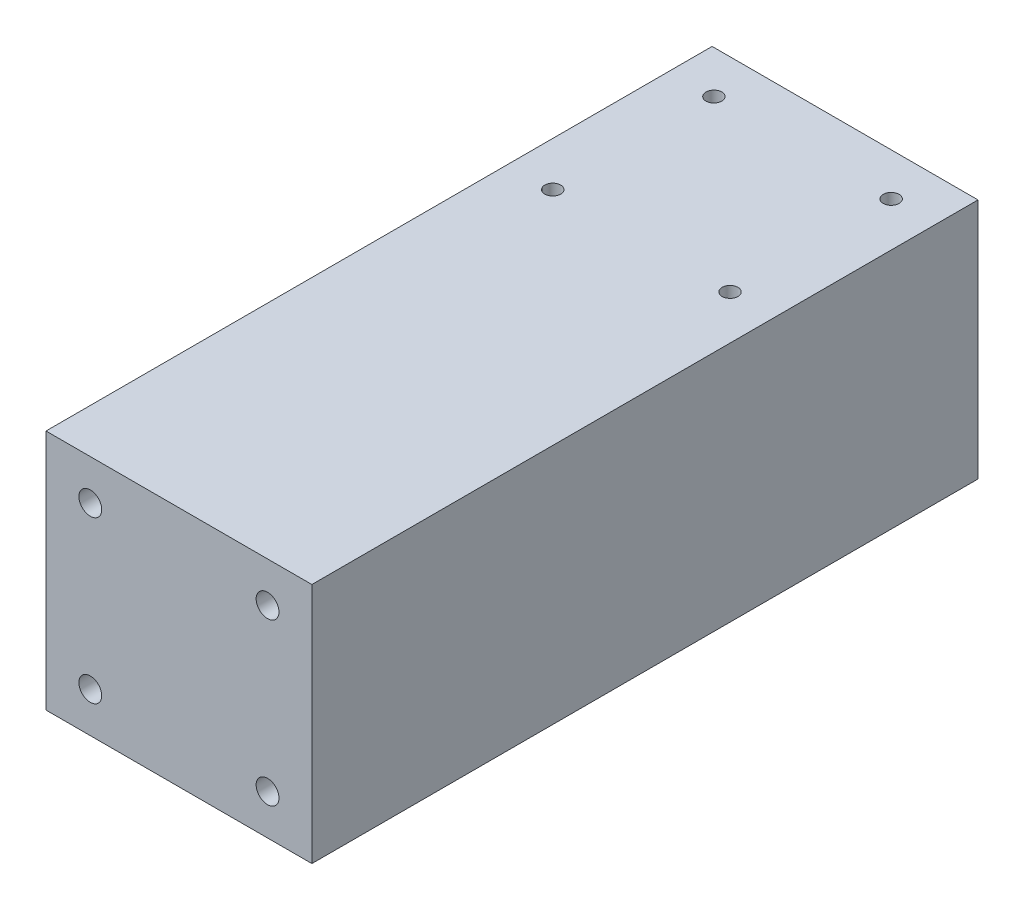
ISO-10303-21;
HEADER;
FILE_DESCRIPTION(('STEP AP214'),'2;1');
FILE_NAME('part.step','',(''),(''),'','','');
FILE_SCHEMA(('AUTOMOTIVE_DESIGN { 1 0 10303 214 1 1 1 1 }'));
ENDSEC;
DATA;
#1=APPLICATION_CONTEXT('core data for automotive mechanical design processes');
#2=APPLICATION_PROTOCOL_DEFINITION('international standard','automotive_design',2000,#1);
#3=PRODUCT_CONTEXT('',#1,'mechanical');
#4=PRODUCT('Part','Part','',(#3));
#5=PRODUCT_RELATED_PRODUCT_CATEGORY('part','',(#4));
#6=PRODUCT_DEFINITION_FORMATION('','',#4);
#7=PRODUCT_DEFINITION_CONTEXT('part definition',#1,'design');
#8=PRODUCT_DEFINITION('design','',#6,#7);
#9=PRODUCT_DEFINITION_SHAPE('','',#8);
#10=(LENGTH_UNIT() NAMED_UNIT(*) SI_UNIT(.MILLI.,.METRE.));
#11=(NAMED_UNIT(*) PLANE_ANGLE_UNIT() SI_UNIT($,.RADIAN.));
#12=(NAMED_UNIT(*) SI_UNIT($,.STERADIAN.) SOLID_ANGLE_UNIT());
#13=UNCERTAINTY_MEASURE_WITH_UNIT(LENGTH_MEASURE(1.E-05),#10,'distance_accuracy_value','');
#14=(GEOMETRIC_REPRESENTATION_CONTEXT(3) GLOBAL_UNCERTAINTY_ASSIGNED_CONTEXT((#13)) GLOBAL_UNIT_ASSIGNED_CONTEXT((#10,
#11,#12)) REPRESENTATION_CONTEXT('',''));
#15=CARTESIAN_POINT('',(0.,0.,0.));
#16=DIRECTION('',(0.,0.,1.));
#17=DIRECTION('',(1.,0.,0.));
#18=AXIS2_PLACEMENT_3D('',#15,#16,#17);
#19=CARTESIAN_POINT('',(20.955,0.,5.));
#20=DIRECTION('',(1.,0.,0.));
#21=DIRECTION('',(0.,0.,-1.));
#22=AXIS2_PLACEMENT_3D('',#19,#20,#21);
#23=PLANE('',#22);
#24=DIRECTION('',(0.,0.,-1.));
#25=VECTOR('',#24,1.);
#26=CARTESIAN_POINT('',(20.955,-38.1,5.));
#27=LINE('',#26,#25);
#28=CARTESIAN_POINT('',(20.955,-38.1,5.));
#29=VERTEX_POINT('',#28);
#30=CARTESIAN_POINT('',(20.955,-38.1,-100.));
#31=VERTEX_POINT('',#30);
#32=EDGE_CURVE('E233',#29,#31,#27,.T.);
#33=ORIENTED_EDGE('',*,*,#32,.T.);
#34=DIRECTION('',(0.,-1.,0.));
#35=VECTOR('',#34,1.);
#36=CARTESIAN_POINT('',(20.955,0.,-100.));
#37=LINE('',#36,#35);
#38=CARTESIAN_POINT('',(20.955,0.,-100.));
#39=VERTEX_POINT('',#38);
#40=EDGE_CURVE('E170',#39,#31,#37,.T.);
#41=ORIENTED_EDGE('',*,*,#40,.F.);
#42=DIRECTION('',(0.,0.,-1.));
#43=VECTOR('',#42,1.);
#44=CARTESIAN_POINT('',(20.955,0.,5.));
#45=LINE('',#44,#43);
#46=CARTESIAN_POINT('',(20.955,0.,5.));
#47=VERTEX_POINT('',#46);
#48=EDGE_CURVE('E11',#47,#39,#45,.T.);
#49=ORIENTED_EDGE('',*,*,#48,.F.);
#50=DIRECTION('',(0.,-1.,0.));
#51=VECTOR('',#50,1.);
#52=CARTESIAN_POINT('',(20.955,0.,5.));
#53=LINE('',#52,#51);
#54=EDGE_CURVE('E220',#47,#29,#53,.T.);
#55=ORIENTED_EDGE('',*,*,#54,.T.);
#56=EDGE_LOOP('',(#33,#41,#49,#55));
#57=FACE_BOUND('',#56,.T.);
#58=ADVANCED_FACE('F49',(#57),#23,.T.);
#59=CARTESIAN_POINT('',(0.,0.,5.));
#60=DIRECTION('',(0.,1.,0.));
#61=DIRECTION('',(0.,0.,1.));
#62=AXIS2_PLACEMENT_3D('',#59,#60,#61);
#63=PLANE('',#62);
#64=CARTESIAN_POINT('',(13.97,0.,-67.8956101426682));
#65=DIRECTION('',(0.,1.,0.));
#66=DIRECTION('',(0.,0.,1.));
#67=AXIS2_PLACEMENT_3D('',#64,#65,#66);
#68=CIRCLE('',#67,1.25);
#69=CARTESIAN_POINT('',(13.97,0.,-66.6456101426682));
#70=VERTEX_POINT('',#69);
#71=EDGE_CURVE('E558',#70,#70,#68,.T.);
#72=ORIENTED_EDGE('',*,*,#71,.F.);
#73=EDGE_LOOP('',(#72));
#74=FACE_BOUND('',#73,.T.);
#75=CARTESIAN_POINT('',(13.97,0.,-93.2956101426682));
#76=DIRECTION('',(0.,1.,0.));
#77=DIRECTION('',(0.,0.,1.));
#78=AXIS2_PLACEMENT_3D('',#75,#76,#77);
#79=CIRCLE('',#78,1.25);
#80=CARTESIAN_POINT('',(13.97,0.,-92.0456101426682));
#81=VERTEX_POINT('',#80);
#82=EDGE_CURVE('E563',#81,#81,#79,.T.);
#83=ORIENTED_EDGE('',*,*,#82,.F.);
#84=EDGE_LOOP('',(#83));
#85=FACE_BOUND('',#84,.T.);
#86=CARTESIAN_POINT('',(-13.97,0.,-67.8956101426682));
#87=DIRECTION('',(0.,1.,0.));
#88=DIRECTION('',(0.,0.,1.));
#89=AXIS2_PLACEMENT_3D('',#86,#87,#88);
#90=CIRCLE('',#89,1.25);
#91=CARTESIAN_POINT('',(-13.97,0.,-66.6456101426682));
#92=VERTEX_POINT('',#91);
#93=EDGE_CURVE('E575',#92,#92,#90,.T.);
#94=ORIENTED_EDGE('',*,*,#93,.F.);
#95=EDGE_LOOP('',(#94));
#96=FACE_BOUND('',#95,.T.);
#97=CARTESIAN_POINT('',(-13.97,0.,-93.2956101426682));
#98=DIRECTION('',(0.,1.,0.));
#99=DIRECTION('',(0.,0.,1.));
#100=AXIS2_PLACEMENT_3D('',#97,#98,#99);
#101=CIRCLE('',#100,1.25);
#102=CARTESIAN_POINT('',(-13.97,0.,-92.0456101426682));
#103=VERTEX_POINT('',#102);
#104=EDGE_CURVE('E582',#103,#103,#101,.T.);
#105=ORIENTED_EDGE('',*,*,#104,.F.);
#106=EDGE_LOOP('',(#105));
#107=FACE_BOUND('',#106,.T.);
#108=ORIENTED_EDGE('',*,*,#48,.T.);
#109=DIRECTION('',(1.,0.,0.));
#110=VECTOR('',#109,1.);
#111=CARTESIAN_POINT('',(20.955,0.,-100.));
#112=LINE('',#111,#110);
#113=CARTESIAN_POINT('',(-20.955,0.,-100.));
#114=VERTEX_POINT('',#113);
#115=EDGE_CURVE('E183',#114,#39,#112,.T.);
#116=ORIENTED_EDGE('',*,*,#115,.F.);
#117=DIRECTION('',(0.,0.,-1.));
#118=VECTOR('',#117,1.);
#119=CARTESIAN_POINT('',(-20.955,0.,5.));
#120=LINE('',#119,#118);
#121=CARTESIAN_POINT('',(-20.955,0.,5.));
#122=VERTEX_POINT('',#121);
#123=EDGE_CURVE('E58',#122,#114,#120,.T.);
#124=ORIENTED_EDGE('',*,*,#123,.F.);
#125=DIRECTION('',(1.,0.,0.));
#126=VECTOR('',#125,1.);
#127=CARTESIAN_POINT('',(0.,0.,5.));
#128=LINE('',#127,#126);
#129=EDGE_CURVE('E224',#122,#47,#128,.T.);
#130=ORIENTED_EDGE('',*,*,#129,.T.);
#131=EDGE_LOOP('',(#108,#116,#124,#130));
#132=FACE_BOUND('',#131,.T.);
#133=ADVANCED_FACE('F266',(#74,#85,#96,#107,#132),#63,.T.);
#134=CARTESIAN_POINT('',(-20.955,0.,5.));
#135=DIRECTION('',(1.,0.,0.));
#136=DIRECTION('',(0.,0.,-1.));
#137=AXIS2_PLACEMENT_3D('',#134,#135,#136);
#138=PLANE('',#137);
#139=ORIENTED_EDGE('',*,*,#123,.T.);
#140=DIRECTION('',(0.,1.,0.));
#141=VECTOR('',#140,1.);
#142=CARTESIAN_POINT('',(-20.955,0.,-100.));
#143=LINE('',#142,#141);
#144=CARTESIAN_POINT('',(-20.955,-38.1,-100.));
#145=VERTEX_POINT('',#144);
#146=EDGE_CURVE('E179',#145,#114,#143,.T.);
#147=ORIENTED_EDGE('',*,*,#146,.F.);
#148=DIRECTION('',(0.,0.,-1.));
#149=VECTOR('',#148,1.);
#150=CARTESIAN_POINT('',(-20.955,-38.1,5.));
#151=LINE('',#150,#149);
#152=CARTESIAN_POINT('',(-20.955,-38.1,5.));
#153=VERTEX_POINT('',#152);
#154=EDGE_CURVE('E236',#153,#145,#151,.T.);
#155=ORIENTED_EDGE('',*,*,#154,.F.);
#156=DIRECTION('',(0.,-1.,0.));
#157=VECTOR('',#156,1.);
#158=CARTESIAN_POINT('',(-20.955,0.,5.));
#159=LINE('',#158,#157);
#160=EDGE_CURVE('E228',#122,#153,#159,.T.);
#161=ORIENTED_EDGE('',*,*,#160,.F.);
#162=EDGE_LOOP('',(#139,#147,#155,#161));
#163=FACE_BOUND('',#162,.T.);
#164=ADVANCED_FACE('F272',(#163),#138,.F.);
#165=CARTESIAN_POINT('',(0.,-38.1,5.));
#166=DIRECTION('',(0.,1.,0.));
#167=DIRECTION('',(0.,0.,1.));
#168=AXIS2_PLACEMENT_3D('',#165,#166,#167);
#169=PLANE('',#168);
#170=ORIENTED_EDGE('',*,*,#154,.T.);
#171=DIRECTION('',(-1.,0.,0.));
#172=VECTOR('',#171,1.);
#173=CARTESIAN_POINT('',(20.955,-38.1,-100.));
#174=LINE('',#173,#172);
#175=EDGE_CURVE('E174',#31,#145,#174,.T.);
#176=ORIENTED_EDGE('',*,*,#175,.F.);
#177=ORIENTED_EDGE('',*,*,#32,.F.);
#178=DIRECTION('',(1.,0.,0.));
#179=VECTOR('',#178,1.);
#180=CARTESIAN_POINT('',(0.,-38.1,5.));
#181=LINE('',#180,#179);
#182=EDGE_CURVE('E74',#153,#29,#181,.T.);
#183=ORIENTED_EDGE('',*,*,#182,.F.);
#184=EDGE_LOOP('',(#170,#176,#177,#183));
#185=FACE_BOUND('',#184,.T.);
#186=ADVANCED_FACE('F257',(#185),#169,.F.);
#187=CARTESIAN_POINT('',(0.,0.,5.));
#188=DIRECTION('',(0.,0.,1.));
#189=DIRECTION('',(1.,0.,0.));
#190=AXIS2_PLACEMENT_3D('',#187,#188,#189);
#191=PLANE('',#190);
#192=CARTESIAN_POINT('',(13.97,-6.35,5.));
#193=DIRECTION('',(0.,0.,1.));
#194=DIRECTION('',(1.,0.,0.));
#195=AXIS2_PLACEMENT_3D('',#192,#193,#194);
#196=CIRCLE('',#195,1.79999999999999);
#197=CARTESIAN_POINT('',(15.77,-6.35,5.));
#198=VERTEX_POINT('',#197);
#199=EDGE_CURVE('E52',#198,#198,#196,.T.);
#200=ORIENTED_EDGE('',*,*,#199,.F.);
#201=EDGE_LOOP('',(#200));
#202=FACE_BOUND('',#201,.T.);
#203=CARTESIAN_POINT('',(13.97,-31.75,5.));
#204=DIRECTION('',(0.,0.,1.));
#205=DIRECTION('',(1.,0.,0.));
#206=AXIS2_PLACEMENT_3D('',#203,#204,#205);
#207=CIRCLE('',#206,1.79999999999999);
#208=CARTESIAN_POINT('',(15.77,-31.75,5.));
#209=VERTEX_POINT('',#208);
#210=EDGE_CURVE('E203',#209,#209,#207,.T.);
#211=ORIENTED_EDGE('',*,*,#210,.F.);
#212=EDGE_LOOP('',(#211));
#213=FACE_BOUND('',#212,.T.);
#214=CARTESIAN_POINT('',(-13.97,-31.75,5.));
#215=DIRECTION('',(0.,0.,1.));
#216=DIRECTION('',(1.,0.,0.));
#217=AXIS2_PLACEMENT_3D('',#214,#215,#216);
#218=CIRCLE('',#217,1.79999999999999);
#219=CARTESIAN_POINT('',(-12.17,-31.75,5.));
#220=VERTEX_POINT('',#219);
#221=EDGE_CURVE('E211',#220,#220,#218,.T.);
#222=ORIENTED_EDGE('',*,*,#221,.F.);
#223=EDGE_LOOP('',(#222));
#224=FACE_BOUND('',#223,.T.);
#225=CARTESIAN_POINT('',(-13.97,-6.35,5.));
#226=DIRECTION('',(0.,0.,1.));
#227=DIRECTION('',(1.,0.,0.));
#228=AXIS2_PLACEMENT_3D('',#225,#226,#227);
#229=CIRCLE('',#228,1.79999999999999);
#230=CARTESIAN_POINT('',(-12.17,-6.35,5.));
#231=VERTEX_POINT('',#230);
#232=EDGE_CURVE('E219',#231,#231,#229,.T.);
#233=ORIENTED_EDGE('',*,*,#232,.F.);
#234=EDGE_LOOP('',(#233));
#235=FACE_BOUND('',#234,.T.);
#236=ORIENTED_EDGE('',*,*,#54,.F.);
#237=ORIENTED_EDGE('',*,*,#129,.F.);
#238=ORIENTED_EDGE('',*,*,#160,.T.);
#239=ORIENTED_EDGE('',*,*,#182,.T.);
#240=EDGE_LOOP('',(#236,#237,#238,#239));
#241=FACE_BOUND('',#240,.T.);
#242=ADVANCED_FACE('F253',(#202,#213,#224,#235,#241),#191,.T.);
#243=CARTESIAN_POINT('',(-13.97,-6.35,0.));
#244=DIRECTION('',(0.,0.,-1.));
#245=DIRECTION('',(-1.,0.,0.));
#246=AXIS2_PLACEMENT_3D('',#243,#244,#245);
#247=CYLINDRICAL_SURFACE('',#246,1.79999999999999);
#248=ORIENTED_EDGE('',*,*,#232,.T.);
#249=EDGE_LOOP('',(#248));
#250=FACE_BOUND('',#249,.T.);
#251=CARTESIAN_POINT('',(-13.97,-6.35,1.35));
#252=DIRECTION('',(0.,0.,-1.));
#253=DIRECTION('',(-1.,0.,0.));
#254=AXIS2_PLACEMENT_3D('',#251,#252,#253);
#255=CIRCLE('',#254,1.8);
#256=CARTESIAN_POINT('',(-15.77,-6.35,1.35));
#257=VERTEX_POINT('',#256);
#258=EDGE_CURVE('E215',#257,#257,#255,.T.);
#259=ORIENTED_EDGE('',*,*,#258,.T.);
#260=EDGE_LOOP('',(#259));
#261=FACE_BOUND('',#260,.T.);
#262=ADVANCED_FACE('F256',(#250,#261),#247,.F.);
#263=CARTESIAN_POINT('',(-13.97,-6.35,0.));
#264=DIRECTION('',(0.,0.,-1.));
#265=DIRECTION('',(-1.,0.,0.));
#266=AXIS2_PLACEMENT_3D('',#263,#264,#265);
#267=CONICAL_SURFACE('',#266,3.15,0.785398163397448);
#268=ORIENTED_EDGE('',*,*,#258,.F.);
#269=EDGE_LOOP('',(#268));
#270=FACE_BOUND('',#269,.T.);
#271=CARTESIAN_POINT('',(-13.97,-6.35,0.));
#272=DIRECTION('',(0.,0.,-1.));
#273=DIRECTION('',(-1.,0.,0.));
#274=AXIS2_PLACEMENT_3D('',#271,#272,#273);
#275=CIRCLE('',#274,3.15);
#276=CARTESIAN_POINT('',(-17.12,-6.35,0.));
#277=VERTEX_POINT('',#276);
#278=EDGE_CURVE('E175',#277,#277,#275,.T.);
#279=ORIENTED_EDGE('',*,*,#278,.T.);
#280=EDGE_LOOP('',(#279));
#281=FACE_BOUND('',#280,.T.);
#282=ADVANCED_FACE('F308',(#270,#281),#267,.F.);
#283=CARTESIAN_POINT('',(-13.97,-31.75,0.));
#284=DIRECTION('',(0.,0.,-1.));
#285=DIRECTION('',(-1.,0.,0.));
#286=AXIS2_PLACEMENT_3D('',#283,#284,#285);
#287=CYLINDRICAL_SURFACE('',#286,1.79999999999999);
#288=ORIENTED_EDGE('',*,*,#221,.T.);
#289=EDGE_LOOP('',(#288));
#290=FACE_BOUND('',#289,.T.);
#291=CARTESIAN_POINT('',(-13.97,-31.75,1.35));
#292=DIRECTION('',(0.,0.,-1.));
#293=DIRECTION('',(-1.,0.,0.));
#294=AXIS2_PLACEMENT_3D('',#291,#292,#293);
#295=CIRCLE('',#294,1.79999999999999);
#296=CARTESIAN_POINT('',(-15.77,-31.75,1.35));
#297=VERTEX_POINT('',#296);
#298=EDGE_CURVE('E207',#297,#297,#295,.T.);
#299=ORIENTED_EDGE('',*,*,#298,.T.);
#300=EDGE_LOOP('',(#299));
#301=FACE_BOUND('',#300,.T.);
#302=ADVANCED_FACE('F312',(#290,#301),#287,.F.);
#303=CARTESIAN_POINT('',(-13.97,-31.75,0.));
#304=DIRECTION('',(0.,0.,-1.));
#305=DIRECTION('',(-1.,0.,0.));
#306=AXIS2_PLACEMENT_3D('',#303,#304,#305);
#307=CONICAL_SURFACE('',#306,3.15,0.785398163397451);
#308=ORIENTED_EDGE('',*,*,#298,.F.);
#309=EDGE_LOOP('',(#308));
#310=FACE_BOUND('',#309,.T.);
#311=CARTESIAN_POINT('',(-13.97,-31.75,0.));
#312=DIRECTION('',(0.,0.,-1.));
#313=DIRECTION('',(-1.,0.,0.));
#314=AXIS2_PLACEMENT_3D('',#311,#312,#313);
#315=CIRCLE('',#314,3.15);
#316=CARTESIAN_POINT('',(-17.12,-31.75,0.));
#317=VERTEX_POINT('',#316);
#318=EDGE_CURVE('E198',#317,#317,#315,.T.);
#319=ORIENTED_EDGE('',*,*,#318,.T.);
#320=EDGE_LOOP('',(#319));
#321=FACE_BOUND('',#320,.T.);
#322=ADVANCED_FACE('F316',(#310,#321),#307,.F.);
#323=CARTESIAN_POINT('',(13.97,-31.75,0.));
#324=DIRECTION('',(0.,0.,-1.));
#325=DIRECTION('',(-1.,0.,0.));
#326=AXIS2_PLACEMENT_3D('',#323,#324,#325);
#327=CYLINDRICAL_SURFACE('',#326,1.79999999999999);
#328=ORIENTED_EDGE('',*,*,#210,.T.);
#329=EDGE_LOOP('',(#328));
#330=FACE_BOUND('',#329,.T.);
#331=CARTESIAN_POINT('',(13.97,-31.75,1.35));
#332=DIRECTION('',(0.,0.,-1.));
#333=DIRECTION('',(-1.,0.,0.));
#334=AXIS2_PLACEMENT_3D('',#331,#332,#333);
#335=CIRCLE('',#334,1.79999999999999);
#336=CARTESIAN_POINT('',(12.17,-31.75,1.35));
#337=VERTEX_POINT('',#336);
#338=EDGE_CURVE('E199',#337,#337,#335,.T.);
#339=ORIENTED_EDGE('',*,*,#338,.T.);
#340=EDGE_LOOP('',(#339));
#341=FACE_BOUND('',#340,.T.);
#342=ADVANCED_FACE('F250',(#330,#341),#327,.F.);
#343=CARTESIAN_POINT('',(13.97,-31.75,0.));
#344=DIRECTION('',(0.,0.,-1.));
#345=DIRECTION('',(-1.,0.,0.));
#346=AXIS2_PLACEMENT_3D('',#343,#344,#345);
#347=CONICAL_SURFACE('',#346,3.15,0.785398163397451);
#348=ORIENTED_EDGE('',*,*,#338,.F.);
#349=EDGE_LOOP('',(#348));
#350=FACE_BOUND('',#349,.T.);
#351=CARTESIAN_POINT('',(13.97,-31.75,0.));
#352=DIRECTION('',(0.,0.,-1.));
#353=DIRECTION('',(-1.,0.,0.));
#354=AXIS2_PLACEMENT_3D('',#351,#352,#353);
#355=CIRCLE('',#354,3.15);
#356=CARTESIAN_POINT('',(10.82,-31.75,0.));
#357=VERTEX_POINT('',#356);
#358=EDGE_CURVE('E191',#357,#357,#355,.T.);
#359=ORIENTED_EDGE('',*,*,#358,.T.);
#360=EDGE_LOOP('',(#359));
#361=FACE_BOUND('',#360,.T.);
#362=ADVANCED_FACE('F323',(#350,#361),#347,.F.);
#363=CARTESIAN_POINT('',(13.97,-6.35,0.));
#364=DIRECTION('',(0.,0.,-1.));
#365=DIRECTION('',(-1.,0.,0.));
#366=AXIS2_PLACEMENT_3D('',#363,#364,#365);
#367=CYLINDRICAL_SURFACE('',#366,1.79999999999999);
#368=ORIENTED_EDGE('',*,*,#199,.T.);
#369=EDGE_LOOP('',(#368));
#370=FACE_BOUND('',#369,.T.);
#371=CARTESIAN_POINT('',(13.97,-6.35,1.35));
#372=DIRECTION('',(0.,0.,-1.));
#373=DIRECTION('',(-1.,0.,0.));
#374=AXIS2_PLACEMENT_3D('',#371,#372,#373);
#375=CIRCLE('',#374,1.79999999999999);
#376=CARTESIAN_POINT('',(12.17,-6.35,1.35));
#377=VERTEX_POINT('',#376);
#378=EDGE_CURVE('E187',#377,#377,#375,.T.);
#379=ORIENTED_EDGE('',*,*,#378,.T.);
#380=EDGE_LOOP('',(#379));
#381=FACE_BOUND('',#380,.T.);
#382=ADVANCED_FACE('F289',(#370,#381),#367,.F.);
#383=CARTESIAN_POINT('',(13.97,-6.35,0.));
#384=DIRECTION('',(0.,0.,-1.));
#385=DIRECTION('',(-1.,0.,0.));
#386=AXIS2_PLACEMENT_3D('',#383,#384,#385);
#387=CONICAL_SURFACE('',#386,3.15,0.785398163397451);
#388=ORIENTED_EDGE('',*,*,#378,.F.);
#389=EDGE_LOOP('',(#388));
#390=FACE_BOUND('',#389,.T.);
#391=CARTESIAN_POINT('',(13.97,-6.35,0.));
#392=DIRECTION('',(0.,0.,-1.));
#393=DIRECTION('',(-1.,0.,0.));
#394=AXIS2_PLACEMENT_3D('',#391,#392,#393);
#395=CIRCLE('',#394,3.15);
#396=CARTESIAN_POINT('',(10.82,-6.35,0.));
#397=VERTEX_POINT('',#396);
#398=EDGE_CURVE('E164',#397,#397,#395,.T.);
#399=ORIENTED_EDGE('',*,*,#398,.T.);
#400=EDGE_LOOP('',(#399));
#401=FACE_BOUND('',#400,.T.);
#402=ADVANCED_FACE('F279',(#390,#401),#387,.F.);
#403=CARTESIAN_POINT('',(0.,0.,-100.));
#404=DIRECTION('',(0.,0.,-1.));
#405=DIRECTION('',(-1.,0.,0.));
#406=AXIS2_PLACEMENT_3D('',#403,#404,#405);
#407=PLANE('',#406);
#408=DIRECTION('',(0.,1.,0.));
#409=VECTOR('',#408,1.);
#410=CARTESIAN_POINT('',(-17.7293437083336,-2.70339356806456,-100.));
#411=LINE('',#410,#409);
#412=CARTESIAN_POINT('',(-17.7293437083336,-35.2450735797282,-100.));
#413=VERTEX_POINT('',#412);
#414=CARTESIAN_POINT('',(-17.7293437083336,-2.70339356806456,-100.));
#415=VERTEX_POINT('',#414);
#416=EDGE_CURVE('E66',#413,#415,#411,.T.);
#417=ORIENTED_EDGE('',*,*,#416,.F.);
#418=DIRECTION('',(-1.,0.,0.));
#419=VECTOR('',#418,1.);
#420=CARTESIAN_POINT('',(17.7293437083336,-35.2450735797282,-100.));
#421=LINE('',#420,#419);
#422=CARTESIAN_POINT('',(17.7293437083336,-35.2450735797282,-100.));
#423=VERTEX_POINT('',#422);
#424=EDGE_CURVE('E139',#423,#413,#421,.T.);
#425=ORIENTED_EDGE('',*,*,#424,.F.);
#426=DIRECTION('',(0.,-1.,0.));
#427=VECTOR('',#426,1.);
#428=CARTESIAN_POINT('',(17.7293437083336,-2.70339356806456,-100.));
#429=LINE('',#428,#427);
#430=CARTESIAN_POINT('',(17.7293437083336,-2.70339356806456,-100.));
#431=VERTEX_POINT('',#430);
#432=EDGE_CURVE('E143',#431,#423,#429,.T.);
#433=ORIENTED_EDGE('',*,*,#432,.F.);
#434=DIRECTION('',(1.,0.,0.));
#435=VECTOR('',#434,1.);
#436=CARTESIAN_POINT('',(17.7293437083336,-2.70339356806456,-100.));
#437=LINE('',#436,#435);
#438=EDGE_CURVE('E155',#415,#431,#437,.T.);
#439=ORIENTED_EDGE('',*,*,#438,.F.);
#440=EDGE_LOOP('',(#417,#425,#433,#439));
#441=FACE_BOUND('',#440,.T.);
#442=ORIENTED_EDGE('',*,*,#40,.T.);
#443=ORIENTED_EDGE('',*,*,#175,.T.);
#444=ORIENTED_EDGE('',*,*,#146,.T.);
#445=ORIENTED_EDGE('',*,*,#115,.T.);
#446=EDGE_LOOP('',(#442,#443,#444,#445));
#447=FACE_BOUND('',#446,.T.);
#448=ADVANCED_FACE('F277',(#441,#447),#407,.T.);
#449=CARTESIAN_POINT('',(-17.7293437083336,-2.70339356806456,0.));
#450=DIRECTION('',(-1.,0.,0.));
#451=DIRECTION('',(0.,-1.,0.));
#452=AXIS2_PLACEMENT_3D('',#449,#450,#451);
#453=PLANE('',#452);
#454=ORIENTED_EDGE('',*,*,#416,.T.);
#455=DIRECTION('',(0.,0.,-1.));
#456=VECTOR('',#455,1.);
#457=CARTESIAN_POINT('',(-17.7293437083336,-2.70339356806456,0.));
#458=LINE('',#457,#456);
#459=CARTESIAN_POINT('',(-17.7293437083336,-2.70339356806456,0.));
#460=VERTEX_POINT('',#459);
#461=EDGE_CURVE('E114',#460,#415,#458,.T.);
#462=ORIENTED_EDGE('',*,*,#461,.F.);
#463=DIRECTION('',(0.,1.,0.));
#464=VECTOR('',#463,1.);
#465=CARTESIAN_POINT('',(-17.7293437083336,-2.70339356806456,0.));
#466=LINE('',#465,#464);
#467=CARTESIAN_POINT('',(-17.7293437083336,-35.2450735797282,0.));
#468=VERTEX_POINT('',#467);
#469=EDGE_CURVE('E118',#468,#460,#466,.T.);
#470=ORIENTED_EDGE('',*,*,#469,.F.);
#471=DIRECTION('',(0.,0.,-1.));
#472=VECTOR('',#471,1.);
#473=CARTESIAN_POINT('',(-17.7293437083336,-35.2450735797282,0.));
#474=LINE('',#473,#472);
#475=EDGE_CURVE('E161',#468,#413,#474,.T.);
#476=ORIENTED_EDGE('',*,*,#475,.T.);
#477=EDGE_LOOP('',(#454,#462,#470,#476));
#478=FACE_BOUND('',#477,.T.);
#479=ADVANCED_FACE('F116',(#478),#453,.F.);
#480=CARTESIAN_POINT('',(17.7293437083336,-35.2450735797282,0.));
#481=DIRECTION('',(0.,-1.,0.));
#482=DIRECTION('',(0.,0.,-1.));
#483=AXIS2_PLACEMENT_3D('',#480,#481,#482);
#484=PLANE('',#483);
#485=ORIENTED_EDGE('',*,*,#424,.T.);
#486=ORIENTED_EDGE('',*,*,#475,.F.);
#487=DIRECTION('',(-1.,0.,0.));
#488=VECTOR('',#487,1.);
#489=CARTESIAN_POINT('',(17.7293437083336,-35.2450735797282,0.));
#490=LINE('',#489,#488);
#491=CARTESIAN_POINT('',(17.7293437083336,-35.2450735797282,0.));
#492=VERTEX_POINT('',#491);
#493=EDGE_CURVE('E125',#492,#468,#490,.T.);
#494=ORIENTED_EDGE('',*,*,#493,.F.);
#495=DIRECTION('',(0.,0.,-1.));
#496=VECTOR('',#495,1.);
#497=CARTESIAN_POINT('',(17.7293437083336,-35.2450735797282,0.));
#498=LINE('',#497,#496);
#499=EDGE_CURVE('E165',#492,#423,#498,.T.);
#500=ORIENTED_EDGE('',*,*,#499,.T.);
#501=EDGE_LOOP('',(#485,#486,#494,#500));
#502=FACE_BOUND('',#501,.T.);
#503=ADVANCED_FACE('F286',(#502),#484,.F.);
#504=CARTESIAN_POINT('',(17.7293437083336,-2.70339356806456,0.));
#505=DIRECTION('',(1.,0.,0.));
#506=DIRECTION('',(0.,0.,-1.));
#507=AXIS2_PLACEMENT_3D('',#504,#505,#506);
#508=PLANE('',#507);
#509=ORIENTED_EDGE('',*,*,#432,.T.);
#510=ORIENTED_EDGE('',*,*,#499,.F.);
#511=DIRECTION('',(0.,-1.,0.));
#512=VECTOR('',#511,1.);
#513=CARTESIAN_POINT('',(17.7293437083336,-2.70339356806456,0.));
#514=LINE('',#513,#512);
#515=CARTESIAN_POINT('',(17.7293437083336,-2.70339356806456,0.));
#516=VERTEX_POINT('',#515);
#517=EDGE_CURVE('E134',#516,#492,#514,.T.);
#518=ORIENTED_EDGE('',*,*,#517,.F.);
#519=DIRECTION('',(0.,0.,-1.));
#520=VECTOR('',#519,1.);
#521=CARTESIAN_POINT('',(17.7293437083336,-2.70339356806456,0.));
#522=LINE('',#521,#520);
#523=EDGE_CURVE('E124',#516,#431,#522,.T.);
#524=ORIENTED_EDGE('',*,*,#523,.T.);
#525=EDGE_LOOP('',(#509,#510,#518,#524));
#526=FACE_BOUND('',#525,.T.);
#527=ADVANCED_FACE('F350',(#526),#508,.F.);
#528=CARTESIAN_POINT('',(17.7293437083336,-2.70339356806456,0.));
#529=DIRECTION('',(0.,1.,0.));
#530=DIRECTION('',(0.,0.,1.));
#531=AXIS2_PLACEMENT_3D('',#528,#529,#530);
#532=PLANE('',#531);
#533=CARTESIAN_POINT('',(13.97,-2.70339356806456,-67.8956101426682));
#534=DIRECTION('',(0.,1.,0.));
#535=DIRECTION('',(0.,0.,1.));
#536=AXIS2_PLACEMENT_3D('',#533,#534,#535);
#537=CIRCLE('',#536,1.25);
#538=CARTESIAN_POINT('',(13.97,-2.70339356806456,-66.6456101426682));
#539=VERTEX_POINT('',#538);
#540=EDGE_CURVE('E561',#539,#539,#537,.T.);
#541=ORIENTED_EDGE('',*,*,#540,.T.);
#542=EDGE_LOOP('',(#541));
#543=FACE_BOUND('',#542,.T.);
#544=CARTESIAN_POINT('',(13.97,-2.70339356806456,-93.2956101426682));
#545=DIRECTION('',(0.,1.,0.));
#546=DIRECTION('',(0.,0.,1.));
#547=AXIS2_PLACEMENT_3D('',#544,#545,#546);
#548=CIRCLE('',#547,1.25);
#549=CARTESIAN_POINT('',(13.97,-2.70339356806456,-92.0456101426682));
#550=VERTEX_POINT('',#549);
#551=EDGE_CURVE('E568',#550,#550,#548,.T.);
#552=ORIENTED_EDGE('',*,*,#551,.T.);
#553=EDGE_LOOP('',(#552));
#554=FACE_BOUND('',#553,.T.);
#555=CARTESIAN_POINT('',(-13.97,-2.70339356806456,-67.8956101426682));
#556=DIRECTION('',(0.,1.,0.));
#557=DIRECTION('',(0.,0.,1.));
#558=AXIS2_PLACEMENT_3D('',#555,#556,#557);
#559=CIRCLE('',#558,1.25);
#560=CARTESIAN_POINT('',(-13.97,-2.70339356806456,-66.6456101426682));
#561=VERTEX_POINT('',#560);
#562=EDGE_CURVE('E579',#561,#561,#559,.T.);
#563=ORIENTED_EDGE('',*,*,#562,.T.);
#564=EDGE_LOOP('',(#563));
#565=FACE_BOUND('',#564,.T.);
#566=CARTESIAN_POINT('',(-13.97,-2.70339356806456,-93.2956101426682));
#567=DIRECTION('',(0.,1.,0.));
#568=DIRECTION('',(0.,0.,1.));
#569=AXIS2_PLACEMENT_3D('',#566,#567,#568);
#570=CIRCLE('',#569,1.25);
#571=CARTESIAN_POINT('',(-13.97,-2.70339356806456,-92.0456101426682));
#572=VERTEX_POINT('',#571);
#573=EDGE_CURVE('E146',#572,#572,#570,.T.);
#574=ORIENTED_EDGE('',*,*,#573,.T.);
#575=EDGE_LOOP('',(#574));
#576=FACE_BOUND('',#575,.T.);
#577=ORIENTED_EDGE('',*,*,#438,.T.);
#578=ORIENTED_EDGE('',*,*,#523,.F.);
#579=DIRECTION('',(1.,0.,0.));
#580=VECTOR('',#579,1.);
#581=CARTESIAN_POINT('',(17.7293437083336,-2.70339356806456,0.));
#582=LINE('',#581,#580);
#583=EDGE_CURVE('E128',#460,#516,#582,.T.);
#584=ORIENTED_EDGE('',*,*,#583,.F.);
#585=ORIENTED_EDGE('',*,*,#461,.T.);
#586=EDGE_LOOP('',(#577,#578,#584,#585));
#587=FACE_BOUND('',#586,.T.);
#588=ADVANCED_FACE('F129',(#543,#554,#565,#576,#587),#532,.F.);
#589=CARTESIAN_POINT('',(0.,0.,0.));
#590=DIRECTION('',(0.,0.,-1.));
#591=DIRECTION('',(-1.,0.,0.));
#592=AXIS2_PLACEMENT_3D('',#589,#590,#591);
#593=PLANE('',#592);
#594=ORIENTED_EDGE('',*,*,#278,.F.);
#595=EDGE_LOOP('',(#594));
#596=FACE_BOUND('',#595,.T.);
#597=ORIENTED_EDGE('',*,*,#318,.F.);
#598=EDGE_LOOP('',(#597));
#599=FACE_BOUND('',#598,.T.);
#600=ORIENTED_EDGE('',*,*,#358,.F.);
#601=EDGE_LOOP('',(#600));
#602=FACE_BOUND('',#601,.T.);
#603=ORIENTED_EDGE('',*,*,#398,.F.);
#604=EDGE_LOOP('',(#603));
#605=FACE_BOUND('',#604,.T.);
#606=ORIENTED_EDGE('',*,*,#469,.T.);
#607=ORIENTED_EDGE('',*,*,#583,.T.);
#608=ORIENTED_EDGE('',*,*,#517,.T.);
#609=ORIENTED_EDGE('',*,*,#493,.T.);
#610=EDGE_LOOP('',(#606,#607,#608,#609));
#611=FACE_BOUND('',#610,.T.);
#612=ADVANCED_FACE('F136',(#596,#599,#602,#605,#611),#593,.T.);
#613=CARTESIAN_POINT('',(-13.97,0.,-93.2956101426682));
#614=DIRECTION('',(0.,1.,0.));
#615=DIRECTION('',(0.,0.,1.));
#616=AXIS2_PLACEMENT_3D('',#613,#614,#615);
#617=CYLINDRICAL_SURFACE('',#616,1.25);
#618=ORIENTED_EDGE('',*,*,#104,.T.);
#619=EDGE_LOOP('',(#618));
#620=FACE_BOUND('',#619,.T.);
#621=ORIENTED_EDGE('',*,*,#573,.F.);
#622=EDGE_LOOP('',(#621));
#623=FACE_BOUND('',#622,.T.);
#624=ADVANCED_FACE('F339',(#620,#623),#617,.F.);
#625=CARTESIAN_POINT('',(-13.97,0.,-67.8956101426682));
#626=DIRECTION('',(0.,1.,0.));
#627=DIRECTION('',(0.,0.,1.));
#628=AXIS2_PLACEMENT_3D('',#625,#626,#627);
#629=CYLINDRICAL_SURFACE('',#628,1.25);
#630=ORIENTED_EDGE('',*,*,#93,.T.);
#631=EDGE_LOOP('',(#630));
#632=FACE_BOUND('',#631,.T.);
#633=ORIENTED_EDGE('',*,*,#562,.F.);
#634=EDGE_LOOP('',(#633));
#635=FACE_BOUND('',#634,.T.);
#636=ADVANCED_FACE('F346',(#632,#635),#629,.F.);
#637=CARTESIAN_POINT('',(13.97,0.,-93.2956101426682));
#638=DIRECTION('',(0.,1.,0.));
#639=DIRECTION('',(0.,0.,1.));
#640=AXIS2_PLACEMENT_3D('',#637,#638,#639);
#641=CYLINDRICAL_SURFACE('',#640,1.25);
#642=ORIENTED_EDGE('',*,*,#82,.T.);
#643=EDGE_LOOP('',(#642));
#644=FACE_BOUND('',#643,.T.);
#645=ORIENTED_EDGE('',*,*,#551,.F.);
#646=EDGE_LOOP('',(#645));
#647=FACE_BOUND('',#646,.T.);
#648=ADVANCED_FACE('F524',(#644,#647),#641,.F.);
#649=CARTESIAN_POINT('',(13.97,0.,-67.8956101426682));
#650=DIRECTION('',(0.,1.,0.));
#651=DIRECTION('',(0.,0.,1.));
#652=AXIS2_PLACEMENT_3D('',#649,#650,#651);
#653=CYLINDRICAL_SURFACE('',#652,1.25);
#654=ORIENTED_EDGE('',*,*,#71,.T.);
#655=EDGE_LOOP('',(#654));
#656=FACE_BOUND('',#655,.T.);
#657=ORIENTED_EDGE('',*,*,#540,.F.);
#658=EDGE_LOOP('',(#657));
#659=FACE_BOUND('',#658,.T.);
#660=ADVANCED_FACE('F532',(#656,#659),#653,.F.);
#661=CLOSED_SHELL('',(#58,#133,#164,#186,#242,#262,#282,#302,#322,#342,#362,#382,#402,#448,#479,
#503,#527,#588,#612,#624,#636,#648,#660));
#662=MANIFOLD_SOLID_BREP('B2',#661);
#663=ADVANCED_BREP_SHAPE_REPRESENTATION('',(#18,#662),#14);
#664=SHAPE_DEFINITION_REPRESENTATION(#9,#663);
ENDSEC;
END-ISO-10303-21;
